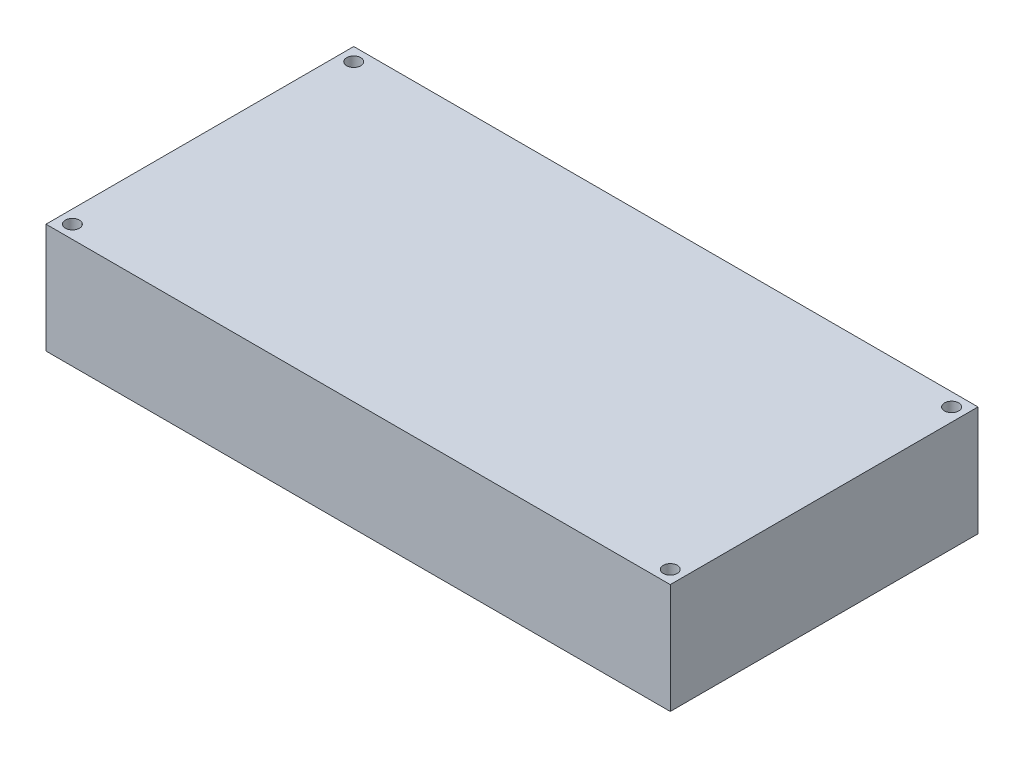
ISO-10303-21;
HEADER;
FILE_DESCRIPTION(('STEP AP214'),'2;1');
FILE_NAME('part.step','',(''),(''),'','','');
FILE_SCHEMA(('AUTOMOTIVE_DESIGN { 1 0 10303 214 1 1 1 1 }'));
ENDSEC;
DATA;
#1=APPLICATION_CONTEXT('core data for automotive mechanical design processes');
#2=APPLICATION_PROTOCOL_DEFINITION('international standard','automotive_design',2000,#1);
#3=PRODUCT_CONTEXT('',#1,'mechanical');
#4=PRODUCT('Part','Part','',(#3));
#5=PRODUCT_RELATED_PRODUCT_CATEGORY('part','',(#4));
#6=PRODUCT_DEFINITION_FORMATION('','',#4);
#7=PRODUCT_DEFINITION_CONTEXT('part definition',#1,'design');
#8=PRODUCT_DEFINITION('design','',#6,#7);
#9=PRODUCT_DEFINITION_SHAPE('','',#8);
#10=(LENGTH_UNIT() NAMED_UNIT(*) SI_UNIT(.MILLI.,.METRE.));
#11=(NAMED_UNIT(*) PLANE_ANGLE_UNIT() SI_UNIT($,.RADIAN.));
#12=(NAMED_UNIT(*) SI_UNIT($,.STERADIAN.) SOLID_ANGLE_UNIT());
#13=UNCERTAINTY_MEASURE_WITH_UNIT(LENGTH_MEASURE(1.E-05),#10,'distance_accuracy_value','');
#14=(GEOMETRIC_REPRESENTATION_CONTEXT(3) GLOBAL_UNCERTAINTY_ASSIGNED_CONTEXT((#13)) GLOBAL_UNIT_ASSIGNED_CONTEXT((#10,
#11,#12)) REPRESENTATION_CONTEXT('',''));
#15=CARTESIAN_POINT('',(0.,0.,0.));
#16=DIRECTION('',(0.,0.,1.));
#17=DIRECTION('',(1.,0.,0.));
#18=AXIS2_PLACEMENT_3D('',#15,#16,#17);
#19=CARTESIAN_POINT('',(0.,39.6875,0.));
#20=DIRECTION('',(0.,1.,0.));
#21=DIRECTION('',(0.,0.,1.));
#22=AXIS2_PLACEMENT_3D('',#19,#20,#21);
#23=PLANE('',#22);
#24=CARTESIAN_POINT('',(107.95,39.6875,50.8));
#25=DIRECTION('',(0.,1.,0.));
#26=DIRECTION('',(0.,0.,1.));
#27=AXIS2_PLACEMENT_3D('',#24,#25,#26);
#28=CIRCLE('',#27,2.55270000000001);
#29=CARTESIAN_POINT('',(107.95,39.6875,48.2473));
#30=VERTEX_POINT('',#29);
#31=EDGE_CURVE('E127',#30,#30,#28,.T.);
#32=ORIENTED_EDGE('',*,*,#31,.F.);
#33=EDGE_LOOP('',(#32));
#34=FACE_BOUND('',#33,.T.);
#35=CARTESIAN_POINT('',(-107.95,39.6875,-50.8));
#36=DIRECTION('',(0.,1.,0.));
#37=DIRECTION('',(0.,0.,1.));
#38=AXIS2_PLACEMENT_3D('',#35,#36,#37);
#39=CIRCLE('',#38,2.55270000000001);
#40=CARTESIAN_POINT('',(-107.95,39.6875,-53.3527));
#41=VERTEX_POINT('',#40);
#42=EDGE_CURVE('E106',#41,#41,#39,.T.);
#43=ORIENTED_EDGE('',*,*,#42,.F.);
#44=EDGE_LOOP('',(#43));
#45=FACE_BOUND('',#44,.T.);
#46=DIRECTION('',(0.,0.,1.));
#47=VECTOR('',#46,1.);
#48=CARTESIAN_POINT('',(-112.7125,39.6875,55.5625));
#49=LINE('',#48,#47);
#50=CARTESIAN_POINT('',(-112.7125,39.6875,-55.5625));
#51=VERTEX_POINT('',#50);
#52=CARTESIAN_POINT('',(-112.7125,39.6875,55.5625));
#53=VERTEX_POINT('',#52);
#54=EDGE_CURVE('E91',#51,#53,#49,.T.);
#55=ORIENTED_EDGE('',*,*,#54,.T.);
#56=DIRECTION('',(1.,0.,0.));
#57=VECTOR('',#56,1.);
#58=CARTESIAN_POINT('',(112.7125,39.6875,55.5625));
#59=LINE('',#58,#57);
#60=CARTESIAN_POINT('',(112.7125,39.6875,55.5625));
#61=VERTEX_POINT('',#60);
#62=EDGE_CURVE('E86',#53,#61,#59,.T.);
#63=ORIENTED_EDGE('',*,*,#62,.T.);
#64=DIRECTION('',(0.,0.,-1.));
#65=VECTOR('',#64,1.);
#66=CARTESIAN_POINT('',(112.7125,39.6875,55.5625));
#67=LINE('',#66,#65);
#68=CARTESIAN_POINT('',(112.7125,39.6875,-55.5625));
#69=VERTEX_POINT('',#68);
#70=EDGE_CURVE('E89',#61,#69,#67,.T.);
#71=ORIENTED_EDGE('',*,*,#70,.T.);
#72=DIRECTION('',(-1.,0.,0.));
#73=VECTOR('',#72,1.);
#74=CARTESIAN_POINT('',(112.7125,39.6875,-55.5625));
#75=LINE('',#74,#73);
#76=EDGE_CURVE('E56',#69,#51,#75,.T.);
#77=ORIENTED_EDGE('',*,*,#76,.T.);
#78=EDGE_LOOP('',(#55,#63,#71,#77));
#79=FACE_BOUND('',#78,.T.);
#80=CARTESIAN_POINT('',(107.95,39.6875,-50.8));
#81=DIRECTION('',(0.,1.,0.));
#82=DIRECTION('',(0.,0.,1.));
#83=AXIS2_PLACEMENT_3D('',#80,#81,#82);
#84=CIRCLE('',#83,2.55270000000001);
#85=CARTESIAN_POINT('',(107.95,39.6875,-53.3527));
#86=VERTEX_POINT('',#85);
#87=EDGE_CURVE('E121',#86,#86,#84,.T.);
#88=ORIENTED_EDGE('',*,*,#87,.F.);
#89=EDGE_LOOP('',(#88));
#90=FACE_BOUND('',#89,.T.);
#91=CARTESIAN_POINT('',(-107.95,39.6875,50.8));
#92=DIRECTION('',(0.,1.,0.));
#93=DIRECTION('',(0.,0.,1.));
#94=AXIS2_PLACEMENT_3D('',#91,#92,#93);
#95=CIRCLE('',#94,2.55270000000001);
#96=CARTESIAN_POINT('',(-107.95,39.6875,48.2473));
#97=VERTEX_POINT('',#96);
#98=EDGE_CURVE('E133',#97,#97,#95,.T.);
#99=ORIENTED_EDGE('',*,*,#98,.F.);
#100=EDGE_LOOP('',(#99));
#101=FACE_BOUND('',#100,.T.);
#102=ADVANCED_FACE('F39',(#34,#45,#79,#90,#101),#23,.T.);
#103=CARTESIAN_POINT('',(0.,0.,0.));
#104=DIRECTION('',(0.,1.,0.));
#105=DIRECTION('',(0.,0.,1.));
#106=AXIS2_PLACEMENT_3D('',#103,#104,#105);
#107=PLANE('',#106);
#108=DIRECTION('',(0.,0.,1.));
#109=VECTOR('',#108,1.);
#110=CARTESIAN_POINT('',(-112.7125,0.,55.5625));
#111=LINE('',#110,#109);
#112=CARTESIAN_POINT('',(-112.7125,0.,-55.5625));
#113=VERTEX_POINT('',#112);
#114=CARTESIAN_POINT('',(-112.7125,0.,55.5625));
#115=VERTEX_POINT('',#114);
#116=EDGE_CURVE('E103',#113,#115,#111,.T.);
#117=ORIENTED_EDGE('',*,*,#116,.F.);
#118=DIRECTION('',(-1.,0.,0.));
#119=VECTOR('',#118,1.);
#120=CARTESIAN_POINT('',(112.7125,0.,-55.5625));
#121=LINE('',#120,#119);
#122=CARTESIAN_POINT('',(112.7125,0.,-55.5625));
#123=VERTEX_POINT('',#122);
#124=EDGE_CURVE('E79',#123,#113,#121,.T.);
#125=ORIENTED_EDGE('',*,*,#124,.F.);
#126=DIRECTION('',(0.,0.,-1.));
#127=VECTOR('',#126,1.);
#128=CARTESIAN_POINT('',(112.7125,0.,55.5625));
#129=LINE('',#128,#127);
#130=CARTESIAN_POINT('',(112.7125,0.,55.5625));
#131=VERTEX_POINT('',#130);
#132=EDGE_CURVE('E73',#131,#123,#129,.T.);
#133=ORIENTED_EDGE('',*,*,#132,.F.);
#134=DIRECTION('',(1.,0.,0.));
#135=VECTOR('',#134,1.);
#136=CARTESIAN_POINT('',(112.7125,0.,55.5625));
#137=LINE('',#136,#135);
#138=EDGE_CURVE('E95',#115,#131,#137,.T.);
#139=ORIENTED_EDGE('',*,*,#138,.F.);
#140=EDGE_LOOP('',(#117,#125,#133,#139));
#141=FACE_BOUND('',#140,.T.);
#142=CARTESIAN_POINT('',(-107.95,0.,-50.8));
#143=DIRECTION('',(0.,1.,0.));
#144=DIRECTION('',(0.,0.,1.));
#145=AXIS2_PLACEMENT_3D('',#142,#143,#144);
#146=CIRCLE('',#145,2.55270000000001);
#147=CARTESIAN_POINT('',(-107.95,0.,-53.3527));
#148=VERTEX_POINT('',#147);
#149=EDGE_CURVE('E118',#148,#148,#146,.T.);
#150=ORIENTED_EDGE('',*,*,#149,.T.);
#151=EDGE_LOOP('',(#150));
#152=FACE_BOUND('',#151,.T.);
#153=CARTESIAN_POINT('',(107.95,0.,-50.8));
#154=DIRECTION('',(0.,1.,0.));
#155=DIRECTION('',(0.,0.,1.));
#156=AXIS2_PLACEMENT_3D('',#153,#154,#155);
#157=CIRCLE('',#156,2.55270000000001);
#158=CARTESIAN_POINT('',(107.95,0.,-53.3527));
#159=VERTEX_POINT('',#158);
#160=EDGE_CURVE('E124',#159,#159,#157,.T.);
#161=ORIENTED_EDGE('',*,*,#160,.T.);
#162=EDGE_LOOP('',(#161));
#163=FACE_BOUND('',#162,.T.);
#164=CARTESIAN_POINT('',(107.95,0.,50.8));
#165=DIRECTION('',(0.,1.,0.));
#166=DIRECTION('',(0.,0.,1.));
#167=AXIS2_PLACEMENT_3D('',#164,#165,#166);
#168=CIRCLE('',#167,2.55270000000001);
#169=CARTESIAN_POINT('',(107.95,0.,48.2473));
#170=VERTEX_POINT('',#169);
#171=EDGE_CURVE('E130',#170,#170,#168,.T.);
#172=ORIENTED_EDGE('',*,*,#171,.T.);
#173=EDGE_LOOP('',(#172));
#174=FACE_BOUND('',#173,.T.);
#175=CARTESIAN_POINT('',(-107.95,0.,50.8));
#176=DIRECTION('',(0.,1.,0.));
#177=DIRECTION('',(0.,0.,1.));
#178=AXIS2_PLACEMENT_3D('',#175,#176,#177);
#179=CIRCLE('',#178,2.55270000000001);
#180=CARTESIAN_POINT('',(-107.95,0.,48.2473));
#181=VERTEX_POINT('',#180);
#182=EDGE_CURVE('E136',#181,#181,#179,.T.);
#183=ORIENTED_EDGE('',*,*,#182,.T.);
#184=EDGE_LOOP('',(#183));
#185=FACE_BOUND('',#184,.T.);
#186=ADVANCED_FACE('F114',(#141,#152,#163,#174,#185),#107,.F.);
#187=CARTESIAN_POINT('',(-112.7125,39.6875,55.5625));
#188=DIRECTION('',(1.,0.,0.));
#189=DIRECTION('',(0.,0.,-1.));
#190=AXIS2_PLACEMENT_3D('',#187,#188,#189);
#191=PLANE('',#190);
#192=ORIENTED_EDGE('',*,*,#116,.T.);
#193=DIRECTION('',(0.,-1.,0.));
#194=VECTOR('',#193,1.);
#195=CARTESIAN_POINT('',(-112.7125,39.6875,55.5625));
#196=LINE('',#195,#194);
#197=EDGE_CURVE('E11',#53,#115,#196,.T.);
#198=ORIENTED_EDGE('',*,*,#197,.F.);
#199=ORIENTED_EDGE('',*,*,#54,.F.);
#200=DIRECTION('',(0.,-1.,0.));
#201=VECTOR('',#200,1.);
#202=CARTESIAN_POINT('',(-112.7125,39.6875,-55.5625));
#203=LINE('',#202,#201);
#204=EDGE_CURVE('E99',#51,#113,#203,.T.);
#205=ORIENTED_EDGE('',*,*,#204,.T.);
#206=EDGE_LOOP('',(#192,#198,#199,#205));
#207=FACE_BOUND('',#206,.T.);
#208=ADVANCED_FACE('F41',(#207),#191,.F.);
#209=CARTESIAN_POINT('',(112.7125,39.6875,55.5625));
#210=DIRECTION('',(0.,0.,-1.));
#211=DIRECTION('',(-1.,0.,0.));
#212=AXIS2_PLACEMENT_3D('',#209,#210,#211);
#213=PLANE('',#212);
#214=ORIENTED_EDGE('',*,*,#138,.T.);
#215=DIRECTION('',(0.,-1.,0.));
#216=VECTOR('',#215,1.);
#217=CARTESIAN_POINT('',(112.7125,39.6875,55.5625));
#218=LINE('',#217,#216);
#219=EDGE_CURVE('E48',#61,#131,#218,.T.);
#220=ORIENTED_EDGE('',*,*,#219,.F.);
#221=ORIENTED_EDGE('',*,*,#62,.F.);
#222=ORIENTED_EDGE('',*,*,#197,.T.);
#223=EDGE_LOOP('',(#214,#220,#221,#222));
#224=FACE_BOUND('',#223,.T.);
#225=ADVANCED_FACE('F94',(#224),#213,.F.);
#226=CARTESIAN_POINT('',(112.7125,39.6875,55.5625));
#227=DIRECTION('',(-1.,0.,0.));
#228=DIRECTION('',(0.,0.,1.));
#229=AXIS2_PLACEMENT_3D('',#226,#227,#228);
#230=PLANE('',#229);
#231=ORIENTED_EDGE('',*,*,#132,.T.);
#232=DIRECTION('',(0.,-1.,0.));
#233=VECTOR('',#232,1.);
#234=CARTESIAN_POINT('',(112.7125,39.6875,-55.5625));
#235=LINE('',#234,#233);
#236=EDGE_CURVE('E96',#69,#123,#235,.T.);
#237=ORIENTED_EDGE('',*,*,#236,.F.);
#238=ORIENTED_EDGE('',*,*,#70,.F.);
#239=ORIENTED_EDGE('',*,*,#219,.T.);
#240=EDGE_LOOP('',(#231,#237,#238,#239));
#241=FACE_BOUND('',#240,.T.);
#242=ADVANCED_FACE('F97',(#241),#230,.F.);
#243=CARTESIAN_POINT('',(112.7125,39.6875,-55.5625));
#244=DIRECTION('',(0.,0.,1.));
#245=DIRECTION('',(1.,0.,0.));
#246=AXIS2_PLACEMENT_3D('',#243,#244,#245);
#247=PLANE('',#246);
#248=ORIENTED_EDGE('',*,*,#124,.T.);
#249=ORIENTED_EDGE('',*,*,#204,.F.);
#250=ORIENTED_EDGE('',*,*,#76,.F.);
#251=ORIENTED_EDGE('',*,*,#236,.T.);
#252=EDGE_LOOP('',(#248,#249,#250,#251));
#253=FACE_BOUND('',#252,.T.);
#254=ADVANCED_FACE('F111',(#253),#247,.F.);
#255=CARTESIAN_POINT('',(-107.95,39.6875,-50.8));
#256=DIRECTION('',(0.,-1.,0.));
#257=DIRECTION('',(0.,0.,-1.));
#258=AXIS2_PLACEMENT_3D('',#255,#256,#257);
#259=CYLINDRICAL_SURFACE('',#258,2.55270000000001);
#260=CARTESIAN_POINT('',(-107.95,39.6875,-53.3527));
#261=CARTESIAN_POINT('',(-107.95,39.2740885416667,-53.3527));
#262=CARTESIAN_POINT('',(-107.95,38.8606770833333,-53.3527));
#263=CARTESIAN_POINT('',(-107.95,38.0338541666667,-53.3527));
#264=CARTESIAN_POINT('',(-107.95,37.6204427083333,-53.3527));
#265=CARTESIAN_POINT('',(-107.95,36.7936197916667,-53.3527));
#266=CARTESIAN_POINT('',(-107.95,36.3802083333333,-53.3527));
#267=CARTESIAN_POINT('',(-107.95,35.5533854166667,-53.3527));
#268=CARTESIAN_POINT('',(-107.95,35.1399739583333,-53.3527));
#269=CARTESIAN_POINT('',(-107.95,34.3131510416667,-53.3527));
#270=CARTESIAN_POINT('',(-107.95,33.8997395833333,-53.3527));
#271=CARTESIAN_POINT('',(-107.95,33.0729166666667,-53.3527));
#272=CARTESIAN_POINT('',(-107.95,32.6595052083333,-53.3527));
#273=CARTESIAN_POINT('',(-107.95,31.8326822916667,-53.3527));
#274=CARTESIAN_POINT('',(-107.95,31.4192708333333,-53.3527));
#275=CARTESIAN_POINT('',(-107.95,30.5924479166667,-53.3527));
#276=CARTESIAN_POINT('',(-107.95,30.1790364583333,-53.3527));
#277=CARTESIAN_POINT('',(-107.95,29.3522135416667,-53.3527));
#278=CARTESIAN_POINT('',(-107.95,28.9388020833333,-53.3527));
#279=CARTESIAN_POINT('',(-107.95,28.1119791666667,-53.3527));
#280=CARTESIAN_POINT('',(-107.95,27.6985677083333,-53.3527));
#281=CARTESIAN_POINT('',(-107.95,26.8717447916667,-53.3527));
#282=CARTESIAN_POINT('',(-107.95,26.4583333333333,-53.3527));
#283=CARTESIAN_POINT('',(-107.95,25.6315104166667,-53.3527));
#284=CARTESIAN_POINT('',(-107.95,25.2180989583333,-53.3527));
#285=CARTESIAN_POINT('',(-107.95,24.3912760416667,-53.3527));
#286=CARTESIAN_POINT('',(-107.95,23.9778645833333,-53.3527));
#287=CARTESIAN_POINT('',(-107.95,23.1510416666667,-53.3527));
#288=CARTESIAN_POINT('',(-107.95,22.7376302083333,-53.3527));
#289=CARTESIAN_POINT('',(-107.95,21.9108072916667,-53.3527));
#290=CARTESIAN_POINT('',(-107.95,21.4973958333333,-53.3527));
#291=CARTESIAN_POINT('',(-107.95,20.6705729166667,-53.3527));
#292=CARTESIAN_POINT('',(-107.95,20.2571614583333,-53.3527));
#293=CARTESIAN_POINT('',(-107.95,19.4303385416667,-53.3527));
#294=CARTESIAN_POINT('',(-107.95,19.0169270833333,-53.3527));
#295=CARTESIAN_POINT('',(-107.95,18.1901041666667,-53.3527));
#296=CARTESIAN_POINT('',(-107.95,17.7766927083333,-53.3527));
#297=CARTESIAN_POINT('',(-107.95,16.9498697916667,-53.3527));
#298=CARTESIAN_POINT('',(-107.95,16.5364583333333,-53.3527));
#299=CARTESIAN_POINT('',(-107.95,15.7096354166667,-53.3527));
#300=CARTESIAN_POINT('',(-107.95,15.2962239583333,-53.3527));
#301=CARTESIAN_POINT('',(-107.95,14.4694010416667,-53.3527));
#302=CARTESIAN_POINT('',(-107.95,14.0559895833333,-53.3527));
#303=CARTESIAN_POINT('',(-107.95,13.2291666666667,-53.3527));
#304=CARTESIAN_POINT('',(-107.95,12.8157552083333,-53.3527));
#305=CARTESIAN_POINT('',(-107.95,11.9889322916667,-53.3527));
#306=CARTESIAN_POINT('',(-107.95,11.5755208333333,-53.3527));
#307=CARTESIAN_POINT('',(-107.95,10.7486979166667,-53.3527));
#308=CARTESIAN_POINT('',(-107.95,10.3352864583333,-53.3527));
#309=CARTESIAN_POINT('',(-107.95,9.50846354166666,-53.3527));
#310=CARTESIAN_POINT('',(-107.95,9.09505208333332,-53.3527));
#311=CARTESIAN_POINT('',(-107.95,8.26822916666666,-53.3527));
#312=CARTESIAN_POINT('',(-107.95,7.85481770833333,-53.3527));
#313=CARTESIAN_POINT('',(-107.95,7.02799479166666,-53.3527));
#314=CARTESIAN_POINT('',(-107.95,6.61458333333333,-53.3527));
#315=CARTESIAN_POINT('',(-107.95,5.78776041666666,-53.3527));
#316=CARTESIAN_POINT('',(-107.95,5.37434895833333,-53.3527));
#317=CARTESIAN_POINT('',(-107.95,4.54752604166666,-53.3527));
#318=CARTESIAN_POINT('',(-107.95,4.13411458333333,-53.3527));
#319=CARTESIAN_POINT('',(-107.95,3.30729166666666,-53.3527));
#320=CARTESIAN_POINT('',(-107.95,2.89388020833333,-53.3527));
#321=CARTESIAN_POINT('',(-107.95,2.06705729166666,-53.3527));
#322=CARTESIAN_POINT('',(-107.95,1.65364583333333,-53.3527));
#323=CARTESIAN_POINT('',(-107.95,0.826822916666662,-53.3527));
#324=CARTESIAN_POINT('',(-107.95,0.413411458333327,-53.3527));
#325=CARTESIAN_POINT('',(-107.95,0.,-53.3527));
#326=B_SPLINE_CURVE_WITH_KNOTS('',3,(#260,#261,#262,#263,#264,#265,#266,#267,#268,#269,#270,
#271,#272,#273,#274,#275,#276,#277,#278,#279,#280,#281,#282,#283,#284,#285,#286,#287,#288,#289,
#290,#291,#292,#293,#294,#295,#296,#297,#298,#299,#300,#301,#302,#303,#304,#305,#306,#307,#308,
#309,#310,#311,#312,#313,#314,#315,#316,#317,#318,#319,#320,#321,#322,#323,#324,#325),
.UNSPECIFIED.,.F.,.F.,(4,2,2,2,2,2,2,2,2,2,2,2,2,2,2,2,2,2,2,2,2,2,2,2,2,2,2,2,2,2,2,2,4),(0.,
1.240234375,2.48046875000001,3.720703125,4.96093750000001,6.20117187500001,7.44140625,
8.68164062500001,9.921875,11.162109375,12.40234375,13.642578125,14.8828125,16.123046875,
17.36328125,18.603515625,19.84375,21.083984375,22.32421875,23.564453125,24.8046875,26.044921875,
27.28515625,28.525390625,29.765625,31.005859375,32.24609375,33.486328125,34.7265625,
35.966796875,37.20703125,38.447265625,39.6875),.UNSPECIFIED.);
#327=EDGE_CURVE('BSEAM155',#41,#148,#326,.T.);
#328=ORIENTED_EDGE('',*,*,#42,.T.);
#329=ORIENTED_EDGE('',*,*,#149,.F.);
#330=ORIENTED_EDGE('',*,*,#327,.T.);
#331=ORIENTED_EDGE('',*,*,#327,.F.);
#332=EDGE_LOOP('',(#328,#330,#329,#331));
#333=FACE_BOUND('',#332,.T.);
#334=ADVANCED_FACE('F155',(#333),#259,.F.);
#335=CARTESIAN_POINT('',(107.95,39.6875,-50.8));
#336=DIRECTION('',(0.,-1.,0.));
#337=DIRECTION('',(0.,0.,-1.));
#338=AXIS2_PLACEMENT_3D('',#335,#336,#337);
#339=CYLINDRICAL_SURFACE('',#338,2.55270000000001);
#340=CARTESIAN_POINT('',(107.95,39.6875,-53.3527));
#341=CARTESIAN_POINT('',(107.95,39.2740885416667,-53.3527));
#342=CARTESIAN_POINT('',(107.95,38.8606770833333,-53.3527));
#343=CARTESIAN_POINT('',(107.95,38.0338541666667,-53.3527));
#344=CARTESIAN_POINT('',(107.95,37.6204427083333,-53.3527));
#345=CARTESIAN_POINT('',(107.95,36.7936197916667,-53.3527));
#346=CARTESIAN_POINT('',(107.95,36.3802083333333,-53.3527));
#347=CARTESIAN_POINT('',(107.95,35.5533854166667,-53.3527));
#348=CARTESIAN_POINT('',(107.95,35.1399739583333,-53.3527));
#349=CARTESIAN_POINT('',(107.95,34.3131510416667,-53.3527));
#350=CARTESIAN_POINT('',(107.95,33.8997395833333,-53.3527));
#351=CARTESIAN_POINT('',(107.95,33.0729166666667,-53.3527));
#352=CARTESIAN_POINT('',(107.95,32.6595052083333,-53.3527));
#353=CARTESIAN_POINT('',(107.95,31.8326822916667,-53.3527));
#354=CARTESIAN_POINT('',(107.95,31.4192708333333,-53.3527));
#355=CARTESIAN_POINT('',(107.95,30.5924479166667,-53.3527));
#356=CARTESIAN_POINT('',(107.95,30.1790364583333,-53.3527));
#357=CARTESIAN_POINT('',(107.95,29.3522135416667,-53.3527));
#358=CARTESIAN_POINT('',(107.95,28.9388020833333,-53.3527));
#359=CARTESIAN_POINT('',(107.95,28.1119791666667,-53.3527));
#360=CARTESIAN_POINT('',(107.95,27.6985677083333,-53.3527));
#361=CARTESIAN_POINT('',(107.95,26.8717447916667,-53.3527));
#362=CARTESIAN_POINT('',(107.95,26.4583333333333,-53.3527));
#363=CARTESIAN_POINT('',(107.95,25.6315104166667,-53.3527));
#364=CARTESIAN_POINT('',(107.95,25.2180989583333,-53.3527));
#365=CARTESIAN_POINT('',(107.95,24.3912760416667,-53.3527));
#366=CARTESIAN_POINT('',(107.95,23.9778645833333,-53.3527));
#367=CARTESIAN_POINT('',(107.95,23.1510416666667,-53.3527));
#368=CARTESIAN_POINT('',(107.95,22.7376302083333,-53.3527));
#369=CARTESIAN_POINT('',(107.95,21.9108072916667,-53.3527));
#370=CARTESIAN_POINT('',(107.95,21.4973958333333,-53.3527));
#371=CARTESIAN_POINT('',(107.95,20.6705729166667,-53.3527));
#372=CARTESIAN_POINT('',(107.95,20.2571614583333,-53.3527));
#373=CARTESIAN_POINT('',(107.95,19.4303385416667,-53.3527));
#374=CARTESIAN_POINT('',(107.95,19.0169270833333,-53.3527));
#375=CARTESIAN_POINT('',(107.95,18.1901041666667,-53.3527));
#376=CARTESIAN_POINT('',(107.95,17.7766927083333,-53.3527));
#377=CARTESIAN_POINT('',(107.95,16.9498697916667,-53.3527));
#378=CARTESIAN_POINT('',(107.95,16.5364583333333,-53.3527));
#379=CARTESIAN_POINT('',(107.95,15.7096354166667,-53.3527));
#380=CARTESIAN_POINT('',(107.95,15.2962239583333,-53.3527));
#381=CARTESIAN_POINT('',(107.95,14.4694010416667,-53.3527));
#382=CARTESIAN_POINT('',(107.95,14.0559895833333,-53.3527));
#383=CARTESIAN_POINT('',(107.95,13.2291666666667,-53.3527));
#384=CARTESIAN_POINT('',(107.95,12.8157552083333,-53.3527));
#385=CARTESIAN_POINT('',(107.95,11.9889322916667,-53.3527));
#386=CARTESIAN_POINT('',(107.95,11.5755208333333,-53.3527));
#387=CARTESIAN_POINT('',(107.95,10.7486979166667,-53.3527));
#388=CARTESIAN_POINT('',(107.95,10.3352864583333,-53.3527));
#389=CARTESIAN_POINT('',(107.95,9.50846354166666,-53.3527));
#390=CARTESIAN_POINT('',(107.95,9.09505208333332,-53.3527));
#391=CARTESIAN_POINT('',(107.95,8.26822916666666,-53.3527));
#392=CARTESIAN_POINT('',(107.95,7.85481770833333,-53.3527));
#393=CARTESIAN_POINT('',(107.95,7.02799479166666,-53.3527));
#394=CARTESIAN_POINT('',(107.95,6.61458333333333,-53.3527));
#395=CARTESIAN_POINT('',(107.95,5.78776041666666,-53.3527));
#396=CARTESIAN_POINT('',(107.95,5.37434895833333,-53.3527));
#397=CARTESIAN_POINT('',(107.95,4.54752604166666,-53.3527));
#398=CARTESIAN_POINT('',(107.95,4.13411458333333,-53.3527));
#399=CARTESIAN_POINT('',(107.95,3.30729166666666,-53.3527));
#400=CARTESIAN_POINT('',(107.95,2.89388020833333,-53.3527));
#401=CARTESIAN_POINT('',(107.95,2.06705729166666,-53.3527));
#402=CARTESIAN_POINT('',(107.95,1.65364583333333,-53.3527));
#403=CARTESIAN_POINT('',(107.95,0.826822916666662,-53.3527));
#404=CARTESIAN_POINT('',(107.95,0.413411458333327,-53.3527));
#405=CARTESIAN_POINT('',(107.95,0.,-53.3527));
#406=B_SPLINE_CURVE_WITH_KNOTS('',3,(#340,#341,#342,#343,#344,#345,#346,#347,#348,#349,#350,
#351,#352,#353,#354,#355,#356,#357,#358,#359,#360,#361,#362,#363,#364,#365,#366,#367,#368,#369,
#370,#371,#372,#373,#374,#375,#376,#377,#378,#379,#380,#381,#382,#383,#384,#385,#386,#387,#388,
#389,#390,#391,#392,#393,#394,#395,#396,#397,#398,#399,#400,#401,#402,#403,#404,#405),
.UNSPECIFIED.,.F.,.F.,(4,2,2,2,2,2,2,2,2,2,2,2,2,2,2,2,2,2,2,2,2,2,2,2,2,2,2,2,2,2,2,2,4),(0.,
1.240234375,2.48046875000001,3.720703125,4.96093750000001,6.20117187500001,7.44140625,
8.68164062500001,9.921875,11.162109375,12.40234375,13.642578125,14.8828125,16.123046875,
17.36328125,18.603515625,19.84375,21.083984375,22.32421875,23.564453125,24.8046875,26.044921875,
27.28515625,28.525390625,29.765625,31.005859375,32.24609375,33.486328125,34.7265625,
35.966796875,37.20703125,38.447265625,39.6875),.UNSPECIFIED.);
#407=EDGE_CURVE('BSEAM209',#86,#159,#406,.T.);
#408=ORIENTED_EDGE('',*,*,#87,.T.);
#409=ORIENTED_EDGE('',*,*,#160,.F.);
#410=ORIENTED_EDGE('',*,*,#407,.T.);
#411=ORIENTED_EDGE('',*,*,#407,.F.);
#412=EDGE_LOOP('',(#408,#410,#409,#411));
#413=FACE_BOUND('',#412,.T.);
#414=ADVANCED_FACE('F209',(#413),#339,.F.);
#415=CARTESIAN_POINT('',(107.95,39.6875,50.8));
#416=DIRECTION('',(0.,-1.,0.));
#417=DIRECTION('',(0.,0.,-1.));
#418=AXIS2_PLACEMENT_3D('',#415,#416,#417);
#419=CYLINDRICAL_SURFACE('',#418,2.55270000000001);
#420=CARTESIAN_POINT('',(107.95,39.6875,48.2473));
#421=CARTESIAN_POINT('',(107.95,39.2740885416667,48.2473));
#422=CARTESIAN_POINT('',(107.95,38.8606770833333,48.2473));
#423=CARTESIAN_POINT('',(107.95,38.0338541666667,48.2473));
#424=CARTESIAN_POINT('',(107.95,37.6204427083333,48.2473));
#425=CARTESIAN_POINT('',(107.95,36.7936197916667,48.2473));
#426=CARTESIAN_POINT('',(107.95,36.3802083333333,48.2473));
#427=CARTESIAN_POINT('',(107.95,35.5533854166667,48.2473));
#428=CARTESIAN_POINT('',(107.95,35.1399739583333,48.2473));
#429=CARTESIAN_POINT('',(107.95,34.3131510416667,48.2473));
#430=CARTESIAN_POINT('',(107.95,33.8997395833333,48.2473));
#431=CARTESIAN_POINT('',(107.95,33.0729166666667,48.2473));
#432=CARTESIAN_POINT('',(107.95,32.6595052083333,48.2473));
#433=CARTESIAN_POINT('',(107.95,31.8326822916667,48.2473));
#434=CARTESIAN_POINT('',(107.95,31.4192708333333,48.2473));
#435=CARTESIAN_POINT('',(107.95,30.5924479166667,48.2473));
#436=CARTESIAN_POINT('',(107.95,30.1790364583333,48.2473));
#437=CARTESIAN_POINT('',(107.95,29.3522135416667,48.2473));
#438=CARTESIAN_POINT('',(107.95,28.9388020833333,48.2473));
#439=CARTESIAN_POINT('',(107.95,28.1119791666667,48.2473));
#440=CARTESIAN_POINT('',(107.95,27.6985677083333,48.2473));
#441=CARTESIAN_POINT('',(107.95,26.8717447916667,48.2473));
#442=CARTESIAN_POINT('',(107.95,26.4583333333333,48.2473));
#443=CARTESIAN_POINT('',(107.95,25.6315104166667,48.2473));
#444=CARTESIAN_POINT('',(107.95,25.2180989583333,48.2473));
#445=CARTESIAN_POINT('',(107.95,24.3912760416667,48.2473));
#446=CARTESIAN_POINT('',(107.95,23.9778645833333,48.2473));
#447=CARTESIAN_POINT('',(107.95,23.1510416666667,48.2473));
#448=CARTESIAN_POINT('',(107.95,22.7376302083333,48.2473));
#449=CARTESIAN_POINT('',(107.95,21.9108072916667,48.2473));
#450=CARTESIAN_POINT('',(107.95,21.4973958333333,48.2473));
#451=CARTESIAN_POINT('',(107.95,20.6705729166667,48.2473));
#452=CARTESIAN_POINT('',(107.95,20.2571614583333,48.2473));
#453=CARTESIAN_POINT('',(107.95,19.4303385416667,48.2473));
#454=CARTESIAN_POINT('',(107.95,19.0169270833333,48.2473));
#455=CARTESIAN_POINT('',(107.95,18.1901041666667,48.2473));
#456=CARTESIAN_POINT('',(107.95,17.7766927083333,48.2473));
#457=CARTESIAN_POINT('',(107.95,16.9498697916667,48.2473));
#458=CARTESIAN_POINT('',(107.95,16.5364583333333,48.2473));
#459=CARTESIAN_POINT('',(107.95,15.7096354166667,48.2473));
#460=CARTESIAN_POINT('',(107.95,15.2962239583333,48.2473));
#461=CARTESIAN_POINT('',(107.95,14.4694010416667,48.2473));
#462=CARTESIAN_POINT('',(107.95,14.0559895833333,48.2473));
#463=CARTESIAN_POINT('',(107.95,13.2291666666667,48.2473));
#464=CARTESIAN_POINT('',(107.95,12.8157552083333,48.2473));
#465=CARTESIAN_POINT('',(107.95,11.9889322916667,48.2473));
#466=CARTESIAN_POINT('',(107.95,11.5755208333333,48.2473));
#467=CARTESIAN_POINT('',(107.95,10.7486979166667,48.2473));
#468=CARTESIAN_POINT('',(107.95,10.3352864583333,48.2473));
#469=CARTESIAN_POINT('',(107.95,9.50846354166666,48.2473));
#470=CARTESIAN_POINT('',(107.95,9.09505208333332,48.2473));
#471=CARTESIAN_POINT('',(107.95,8.26822916666666,48.2473));
#472=CARTESIAN_POINT('',(107.95,7.85481770833333,48.2473));
#473=CARTESIAN_POINT('',(107.95,7.02799479166666,48.2473));
#474=CARTESIAN_POINT('',(107.95,6.61458333333333,48.2473));
#475=CARTESIAN_POINT('',(107.95,5.78776041666666,48.2473));
#476=CARTESIAN_POINT('',(107.95,5.37434895833333,48.2473));
#477=CARTESIAN_POINT('',(107.95,4.54752604166666,48.2473));
#478=CARTESIAN_POINT('',(107.95,4.13411458333333,48.2473));
#479=CARTESIAN_POINT('',(107.95,3.30729166666666,48.2473));
#480=CARTESIAN_POINT('',(107.95,2.89388020833333,48.2473));
#481=CARTESIAN_POINT('',(107.95,2.06705729166666,48.2473));
#482=CARTESIAN_POINT('',(107.95,1.65364583333333,48.2473));
#483=CARTESIAN_POINT('',(107.95,0.826822916666662,48.2473));
#484=CARTESIAN_POINT('',(107.95,0.413411458333327,48.2473));
#485=CARTESIAN_POINT('',(107.95,0.,48.2473));
#486=B_SPLINE_CURVE_WITH_KNOTS('',3,(#420,#421,#422,#423,#424,#425,#426,#427,#428,#429,#430,
#431,#432,#433,#434,#435,#436,#437,#438,#439,#440,#441,#442,#443,#444,#445,#446,#447,#448,#449,
#450,#451,#452,#453,#454,#455,#456,#457,#458,#459,#460,#461,#462,#463,#464,#465,#466,#467,#468,
#469,#470,#471,#472,#473,#474,#475,#476,#477,#478,#479,#480,#481,#482,#483,#484,#485),
.UNSPECIFIED.,.F.,.F.,(4,2,2,2,2,2,2,2,2,2,2,2,2,2,2,2,2,2,2,2,2,2,2,2,2,2,2,2,2,2,2,2,4),(0.,
1.240234375,2.48046875000001,3.720703125,4.96093750000001,6.20117187500001,7.44140625,
8.68164062500001,9.921875,11.162109375,12.40234375,13.642578125,14.8828125,16.123046875,
17.36328125,18.603515625,19.84375,21.083984375,22.32421875,23.564453125,24.8046875,26.044921875,
27.28515625,28.525390625,29.765625,31.005859375,32.24609375,33.486328125,34.7265625,
35.966796875,37.20703125,38.447265625,39.6875),.UNSPECIFIED.);
#487=EDGE_CURVE('BSEAM218',#30,#170,#486,.T.);
#488=ORIENTED_EDGE('',*,*,#31,.T.);
#489=ORIENTED_EDGE('',*,*,#171,.F.);
#490=ORIENTED_EDGE('',*,*,#487,.T.);
#491=ORIENTED_EDGE('',*,*,#487,.F.);
#492=EDGE_LOOP('',(#488,#490,#489,#491));
#493=FACE_BOUND('',#492,.T.);
#494=ADVANCED_FACE('F218',(#493),#419,.F.);
#495=CARTESIAN_POINT('',(-107.95,39.6875,50.8));
#496=DIRECTION('',(0.,-1.,0.));
#497=DIRECTION('',(0.,0.,-1.));
#498=AXIS2_PLACEMENT_3D('',#495,#496,#497);
#499=CYLINDRICAL_SURFACE('',#498,2.55270000000001);
#500=CARTESIAN_POINT('',(-107.95,39.6875,48.2473));
#501=CARTESIAN_POINT('',(-107.95,39.2740885416667,48.2473));
#502=CARTESIAN_POINT('',(-107.95,38.8606770833333,48.2473));
#503=CARTESIAN_POINT('',(-107.95,38.0338541666667,48.2473));
#504=CARTESIAN_POINT('',(-107.95,37.6204427083333,48.2473));
#505=CARTESIAN_POINT('',(-107.95,36.7936197916667,48.2473));
#506=CARTESIAN_POINT('',(-107.95,36.3802083333333,48.2473));
#507=CARTESIAN_POINT('',(-107.95,35.5533854166667,48.2473));
#508=CARTESIAN_POINT('',(-107.95,35.1399739583333,48.2473));
#509=CARTESIAN_POINT('',(-107.95,34.3131510416667,48.2473));
#510=CARTESIAN_POINT('',(-107.95,33.8997395833333,48.2473));
#511=CARTESIAN_POINT('',(-107.95,33.0729166666667,48.2473));
#512=CARTESIAN_POINT('',(-107.95,32.6595052083333,48.2473));
#513=CARTESIAN_POINT('',(-107.95,31.8326822916667,48.2473));
#514=CARTESIAN_POINT('',(-107.95,31.4192708333333,48.2473));
#515=CARTESIAN_POINT('',(-107.95,30.5924479166667,48.2473));
#516=CARTESIAN_POINT('',(-107.95,30.1790364583333,48.2473));
#517=CARTESIAN_POINT('',(-107.95,29.3522135416667,48.2473));
#518=CARTESIAN_POINT('',(-107.95,28.9388020833333,48.2473));
#519=CARTESIAN_POINT('',(-107.95,28.1119791666667,48.2473));
#520=CARTESIAN_POINT('',(-107.95,27.6985677083333,48.2473));
#521=CARTESIAN_POINT('',(-107.95,26.8717447916667,48.2473));
#522=CARTESIAN_POINT('',(-107.95,26.4583333333333,48.2473));
#523=CARTESIAN_POINT('',(-107.95,25.6315104166667,48.2473));
#524=CARTESIAN_POINT('',(-107.95,25.2180989583333,48.2473));
#525=CARTESIAN_POINT('',(-107.95,24.3912760416667,48.2473));
#526=CARTESIAN_POINT('',(-107.95,23.9778645833333,48.2473));
#527=CARTESIAN_POINT('',(-107.95,23.1510416666667,48.2473));
#528=CARTESIAN_POINT('',(-107.95,22.7376302083333,48.2473));
#529=CARTESIAN_POINT('',(-107.95,21.9108072916667,48.2473));
#530=CARTESIAN_POINT('',(-107.95,21.4973958333333,48.2473));
#531=CARTESIAN_POINT('',(-107.95,20.6705729166667,48.2473));
#532=CARTESIAN_POINT('',(-107.95,20.2571614583333,48.2473));
#533=CARTESIAN_POINT('',(-107.95,19.4303385416667,48.2473));
#534=CARTESIAN_POINT('',(-107.95,19.0169270833333,48.2473));
#535=CARTESIAN_POINT('',(-107.95,18.1901041666667,48.2473));
#536=CARTESIAN_POINT('',(-107.95,17.7766927083333,48.2473));
#537=CARTESIAN_POINT('',(-107.95,16.9498697916667,48.2473));
#538=CARTESIAN_POINT('',(-107.95,16.5364583333333,48.2473));
#539=CARTESIAN_POINT('',(-107.95,15.7096354166667,48.2473));
#540=CARTESIAN_POINT('',(-107.95,15.2962239583333,48.2473));
#541=CARTESIAN_POINT('',(-107.95,14.4694010416667,48.2473));
#542=CARTESIAN_POINT('',(-107.95,14.0559895833333,48.2473));
#543=CARTESIAN_POINT('',(-107.95,13.2291666666667,48.2473));
#544=CARTESIAN_POINT('',(-107.95,12.8157552083333,48.2473));
#545=CARTESIAN_POINT('',(-107.95,11.9889322916667,48.2473));
#546=CARTESIAN_POINT('',(-107.95,11.5755208333333,48.2473));
#547=CARTESIAN_POINT('',(-107.95,10.7486979166667,48.2473));
#548=CARTESIAN_POINT('',(-107.95,10.3352864583333,48.2473));
#549=CARTESIAN_POINT('',(-107.95,9.50846354166666,48.2473));
#550=CARTESIAN_POINT('',(-107.95,9.09505208333332,48.2473));
#551=CARTESIAN_POINT('',(-107.95,8.26822916666666,48.2473));
#552=CARTESIAN_POINT('',(-107.95,7.85481770833333,48.2473));
#553=CARTESIAN_POINT('',(-107.95,7.02799479166666,48.2473));
#554=CARTESIAN_POINT('',(-107.95,6.61458333333333,48.2473));
#555=CARTESIAN_POINT('',(-107.95,5.78776041666666,48.2473));
#556=CARTESIAN_POINT('',(-107.95,5.37434895833333,48.2473));
#557=CARTESIAN_POINT('',(-107.95,4.54752604166666,48.2473));
#558=CARTESIAN_POINT('',(-107.95,4.13411458333333,48.2473));
#559=CARTESIAN_POINT('',(-107.95,3.30729166666666,48.2473));
#560=CARTESIAN_POINT('',(-107.95,2.89388020833333,48.2473));
#561=CARTESIAN_POINT('',(-107.95,2.06705729166666,48.2473));
#562=CARTESIAN_POINT('',(-107.95,1.65364583333333,48.2473));
#563=CARTESIAN_POINT('',(-107.95,0.826822916666662,48.2473));
#564=CARTESIAN_POINT('',(-107.95,0.413411458333327,48.2473));
#565=CARTESIAN_POINT('',(-107.95,0.,48.2473));
#566=B_SPLINE_CURVE_WITH_KNOTS('',3,(#500,#501,#502,#503,#504,#505,#506,#507,#508,#509,#510,
#511,#512,#513,#514,#515,#516,#517,#518,#519,#520,#521,#522,#523,#524,#525,#526,#527,#528,#529,
#530,#531,#532,#533,#534,#535,#536,#537,#538,#539,#540,#541,#542,#543,#544,#545,#546,#547,#548,
#549,#550,#551,#552,#553,#554,#555,#556,#557,#558,#559,#560,#561,#562,#563,#564,#565),
.UNSPECIFIED.,.F.,.F.,(4,2,2,2,2,2,2,2,2,2,2,2,2,2,2,2,2,2,2,2,2,2,2,2,2,2,2,2,2,2,2,2,4),(0.,
1.240234375,2.48046875000001,3.720703125,4.96093750000001,6.20117187500001,7.44140625,
8.68164062500001,9.921875,11.162109375,12.40234375,13.642578125,14.8828125,16.123046875,
17.36328125,18.603515625,19.84375,21.083984375,22.32421875,23.564453125,24.8046875,26.044921875,
27.28515625,28.525390625,29.765625,31.005859375,32.24609375,33.486328125,34.7265625,
35.966796875,37.20703125,38.447265625,39.6875),.UNSPECIFIED.);
#567=EDGE_CURVE('BSEAM142',#97,#181,#566,.T.);
#568=ORIENTED_EDGE('',*,*,#98,.T.);
#569=ORIENTED_EDGE('',*,*,#182,.F.);
#570=ORIENTED_EDGE('',*,*,#567,.T.);
#571=ORIENTED_EDGE('',*,*,#567,.F.);
#572=EDGE_LOOP('',(#568,#570,#569,#571));
#573=FACE_BOUND('',#572,.T.);
#574=ADVANCED_FACE('F142',(#573),#499,.F.);
#575=CLOSED_SHELL('',(#102,#186,#208,#225,#242,#254,#334,#414,#494,#574));
#576=MANIFOLD_SOLID_BREP('B2',#575);
#577=ADVANCED_BREP_SHAPE_REPRESENTATION('',(#18,#576),#14);
#578=SHAPE_DEFINITION_REPRESENTATION(#9,#577);
ENDSEC;
END-ISO-10303-21;
